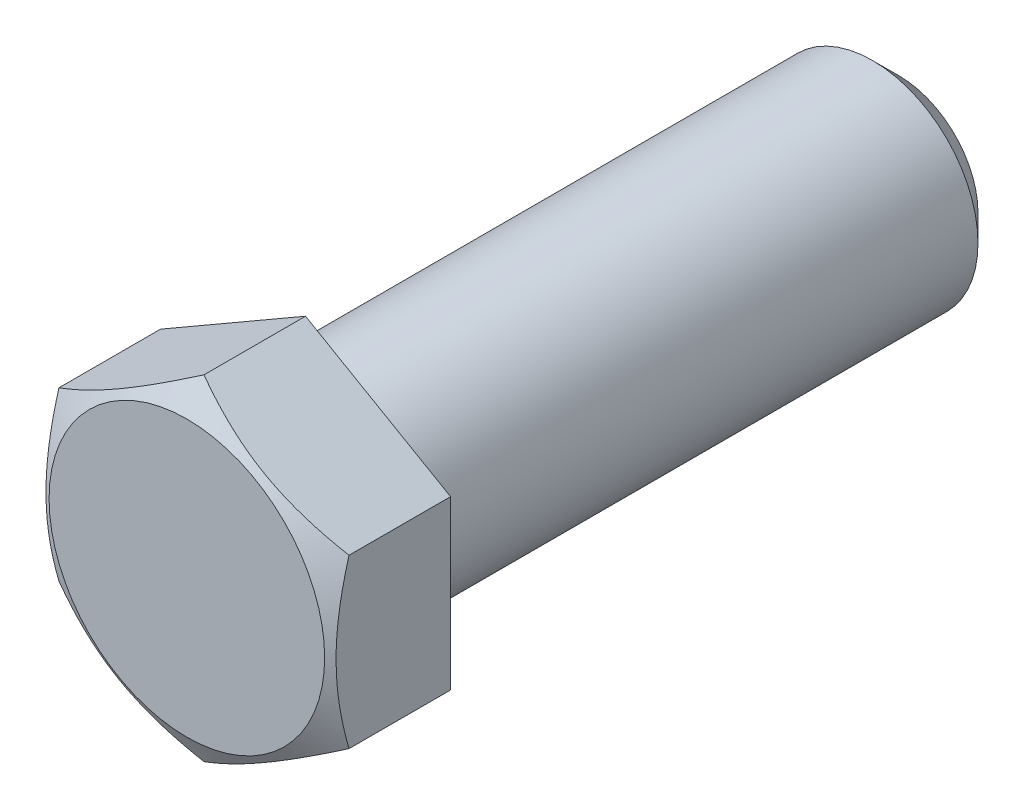
ISO-10303-21;
HEADER;
FILE_DESCRIPTION(('STEP AP214'),'2;1');
FILE_NAME('part.step','',(''),(''),'','','');
FILE_SCHEMA(('AUTOMOTIVE_DESIGN { 1 0 10303 214 1 1 1 1 }'));
ENDSEC;
DATA;
#1=APPLICATION_CONTEXT('core data for automotive mechanical design processes');
#2=APPLICATION_PROTOCOL_DEFINITION('international standard','automotive_design',2000,#1);
#3=PRODUCT_CONTEXT('',#1,'mechanical');
#4=PRODUCT('Part','Part','',(#3));
#5=PRODUCT_RELATED_PRODUCT_CATEGORY('part','',(#4));
#6=PRODUCT_DEFINITION_FORMATION('','',#4);
#7=PRODUCT_DEFINITION_CONTEXT('part definition',#1,'design');
#8=PRODUCT_DEFINITION('design','',#6,#7);
#9=PRODUCT_DEFINITION_SHAPE('','',#8);
#10=(LENGTH_UNIT() NAMED_UNIT(*) SI_UNIT(.MILLI.,.METRE.));
#11=(NAMED_UNIT(*) PLANE_ANGLE_UNIT() SI_UNIT($,.RADIAN.));
#12=(NAMED_UNIT(*) SI_UNIT($,.STERADIAN.) SOLID_ANGLE_UNIT());
#13=UNCERTAINTY_MEASURE_WITH_UNIT(LENGTH_MEASURE(1.E-05),#10,'distance_accuracy_value','');
#14=(GEOMETRIC_REPRESENTATION_CONTEXT(3) GLOBAL_UNCERTAINTY_ASSIGNED_CONTEXT((#13)) GLOBAL_UNIT_ASSIGNED_CONTEXT((#10,
#11,#12)) REPRESENTATION_CONTEXT('',''));
#15=CARTESIAN_POINT('',(0.,0.,0.));
#16=DIRECTION('',(0.,0.,1.));
#17=DIRECTION('',(1.,0.,0.));
#18=AXIS2_PLACEMENT_3D('',#15,#16,#17);
#19=CARTESIAN_POINT('',(-11.,-6.35085296108588,0.));
#20=DIRECTION('',(0.,0.,-1.));
#21=DIRECTION('',(-1.,0.,0.));
#22=AXIS2_PLACEMENT_3D('',#19,#20,#21);
#23=PLANE('',#22);
#24=DIRECTION('',(0.866025403784439,-0.5,0.));
#25=VECTOR('',#24,1.);
#26=CARTESIAN_POINT('',(-11.,-6.35085296108588,0.));
#27=LINE('',#26,#25);
#28=CARTESIAN_POINT('',(-11.,-6.35085296108588,0.));
#29=VERTEX_POINT('',#28);
#30=CARTESIAN_POINT('',(0.,-12.7017059221718,0.));
#31=VERTEX_POINT('',#30);
#32=EDGE_CURVE('E101',#29,#31,#27,.T.);
#33=ORIENTED_EDGE('',*,*,#32,.F.);
#34=DIRECTION('',(0.,-1.,0.));
#35=VECTOR('',#34,1.);
#36=CARTESIAN_POINT('',(-11.,6.35085296108588,0.));
#37=LINE('',#36,#35);
#38=CARTESIAN_POINT('',(-11.,6.35085296108588,0.));
#39=VERTEX_POINT('',#38);
#40=EDGE_CURVE('E106',#39,#29,#37,.T.);
#41=ORIENTED_EDGE('',*,*,#40,.F.);
#42=DIRECTION('',(-0.866025403784439,-0.5,0.));
#43=VECTOR('',#42,1.);
#44=CARTESIAN_POINT('',(0.,12.7017059221718,0.));
#45=LINE('',#44,#43);
#46=CARTESIAN_POINT('',(0.,12.7017059221718,0.));
#47=VERTEX_POINT('',#46);
#48=EDGE_CURVE('E112',#47,#39,#45,.T.);
#49=ORIENTED_EDGE('',*,*,#48,.F.);
#50=DIRECTION('',(-0.866025403784439,0.5,0.));
#51=VECTOR('',#50,1.);
#52=CARTESIAN_POINT('',(11.,6.35085296108588,0.));
#53=LINE('',#52,#51);
#54=CARTESIAN_POINT('',(11.,6.35085296108588,0.));
#55=VERTEX_POINT('',#54);
#56=EDGE_CURVE('E210',#55,#47,#53,.T.);
#57=ORIENTED_EDGE('',*,*,#56,.F.);
#58=DIRECTION('',(0.,1.,0.));
#59=VECTOR('',#58,1.);
#60=CARTESIAN_POINT('',(11.,-6.35085296108588,0.));
#61=LINE('',#60,#59);
#62=CARTESIAN_POINT('',(11.,-6.35085296108588,0.));
#63=VERTEX_POINT('',#62);
#64=EDGE_CURVE('E207',#63,#55,#61,.T.);
#65=ORIENTED_EDGE('',*,*,#64,.F.);
#66=DIRECTION('',(0.866025403784439,0.5,0.));
#67=VECTOR('',#66,1.);
#68=CARTESIAN_POINT('',(0.,-12.7017059221718,0.));
#69=LINE('',#68,#67);
#70=EDGE_CURVE('E204',#31,#63,#69,.T.);
#71=ORIENTED_EDGE('',*,*,#70,.F.);
#72=EDGE_LOOP('',(#33,#41,#49,#57,#65,#71));
#73=FACE_BOUND('',#72,.T.);
#74=CARTESIAN_POINT('',(0.,0.,0.));
#75=DIRECTION('',(0.,0.,-1.));
#76=DIRECTION('',(-1.,0.,0.));
#77=AXIS2_PLACEMENT_3D('',#74,#75,#76);
#78=CIRCLE('',#77,8.);
#79=CARTESIAN_POINT('',(8.,0.,0.));
#80=VERTEX_POINT('',#79);
#81=EDGE_CURVE('E264',#80,#80,#78,.T.);
#82=ORIENTED_EDGE('',*,*,#81,.F.);
#83=EDGE_LOOP('',(#82));
#84=FACE_BOUND('',#83,.T.);
#85=ADVANCED_FACE('F38',(#73,#84),#23,.T.);
#86=CARTESIAN_POINT('',(-11.,-6.35085296108588,9.));
#87=DIRECTION('',(0.5,0.866025403784439,0.));
#88=DIRECTION('',(-0.866025403784439,0.5,0.));
#89=AXIS2_PLACEMENT_3D('',#86,#87,#88);
#90=PLANE('',#89);
#91=CARTESIAN_POINT('',(-11.0002,-6.35073749103204,7.69991031212252));
#92=CARTESIAN_POINT('',(-10.7583962140202,-6.49034297195857,7.78049819661018));
#93=CARTESIAN_POINT('',(-10.515690859196,-6.63046897390006,7.85742843044833));
#94=CARTESIAN_POINT('',(-10.0283338351852,-6.91184468290416,8.00295870862612));
#95=CARTESIAN_POINT('',(-9.78368155388857,-7.05309474336861,8.07155601318414));
#96=CARTESIAN_POINT('',(-9.04578263598059,-7.47912088225752,8.26352099740352));
#97=CARTESIAN_POINT('',(-8.54962304616235,-7.7655787550001,8.37270963004095));
#98=CARTESIAN_POINT('',(-7.8071429686662,-8.19424982761043,8.50074323475039));
#99=CARTESIAN_POINT('',(-7.56304065829185,-8.33518236221487,8.53721514750099));
#100=CARTESIAN_POINT('',(-7.07370581962323,-8.61769996304406,8.59837604550269));
#101=CARTESIAN_POINT('',(-6.82847326966691,-8.7592850417754,8.62306480396288));
#102=CARTESIAN_POINT('',(-6.33759931419012,-9.0426912521081,8.66002700427186));
#103=CARTESIAN_POINT('',(-6.09195874362649,-9.18451190164691,8.67231519963538));
#104=CARTESIAN_POINT('',(-5.60044998596644,-9.46828461519099,8.68421442495612));
#105=CARTESIAN_POINT('',(-5.35458180613744,-9.61023667500043,8.68382584660124));
#106=CARTESIAN_POINT('',(-4.89492981445333,-9.8756168761328,8.6712561825714));
#107=CARTESIAN_POINT('',(-4.68111322379347,-9.99906394230748,8.66060831994059));
#108=CARTESIAN_POINT('',(-4.25397181732484,-10.2456741483142,8.62992572415361));
#109=CARTESIAN_POINT('',(-4.0406470373753,-10.3688372674429,8.60989032700365));
#110=CARTESIAN_POINT('',(-3.61460518506879,-10.6148126455581,8.56078196624697));
#111=CARTESIAN_POINT('',(-3.40188876164769,-10.7376245298813,8.53170153793867));
#112=CARTESIAN_POINT('',(-2.97745318356422,-10.9826725251414,8.46501335258341));
#113=CARTESIAN_POINT('',(-2.76573409768588,-11.1049085963659,8.42740501592751));
#114=CARTESIAN_POINT('',(-2.12304886825006,-11.4759630865848,8.30083743560115));
#115=CARTESIAN_POINT('',(-1.69394387154657,-11.7237069719422,8.19925789346635));
#116=CARTESIAN_POINT('',(-0.842132493034874,-12.2155005006247,7.96871365228279));
#117=CARTESIAN_POINT('',(-0.419415204513995,-12.4595564409434,7.83980310013818));
#118=CARTESIAN_POINT('',(0.000200000000004617,-12.7018213922256,7.69991031212252));
#119=B_SPLINE_CURVE_WITH_KNOTS('',3,(#91,#92,#93,#94,#95,#96,#97,#98,#99,#100,#101,#102,#103,
#104,#105,#106,#107,#108,#109,#110,#111,#112,#113,#114,#115,#116,#117,#118),.UNSPECIFIED.,.F.,
.F.,(4,2,2,2,2,2,2,2,2,2,2,2,2,4),(0.,0.871755124656707,1.74379610209014,3.49159027742165,
4.34403665487446,5.19649943874035,6.04794680882169,6.89936787084372,7.64056020263244,
8.38180496793424,9.1236630996721,9.86557166775902,11.3820155381851,12.8954827156567),.UNSPECIFIED.);
#120=CARTESIAN_POINT('',(-11.,-6.35085296108588,7.69997697969827));
#121=VERTEX_POINT('',#120);
#122=CARTESIAN_POINT('',(0.,-12.7017059221718,7.69997697969827));
#123=VERTEX_POINT('',#122);
#124=EDGE_CURVE('E93',#121,#123,#119,.T.);
#125=ORIENTED_EDGE('',*,*,#124,.F.);
#126=DIRECTION('',(0.,0.,-1.));
#127=VECTOR('',#126,1.);
#128=CARTESIAN_POINT('',(-11.,-6.35085296108588,9.));
#129=LINE('',#128,#127);
#130=EDGE_CURVE('E62',#121,#29,#129,.T.);
#131=ORIENTED_EDGE('',*,*,#130,.T.);
#132=ORIENTED_EDGE('',*,*,#32,.T.);
#133=DIRECTION('',(0.,0.,-1.));
#134=VECTOR('',#133,1.);
#135=CARTESIAN_POINT('',(0.,-12.7017059221718,9.));
#136=LINE('',#135,#134);
#137=EDGE_CURVE('E100',#123,#31,#136,.T.);
#138=ORIENTED_EDGE('',*,*,#137,.F.);
#139=EDGE_LOOP('',(#125,#131,#132,#138));
#140=FACE_BOUND('',#139,.T.);
#141=ADVANCED_FACE('F40',(#140),#90,.F.);
#142=CARTESIAN_POINT('',(0.,-12.7017059221718,9.));
#143=DIRECTION('',(-0.5,0.866025403784439,0.));
#144=DIRECTION('',(-0.866025403784439,-0.5,0.));
#145=AXIS2_PLACEMENT_3D('',#142,#143,#144);
#146=PLANE('',#145);
#147=CARTESIAN_POINT('',(-0.000199999999998275,-12.7018213922256,7.69991031212252));
#148=CARTESIAN_POINT('',(0.24160378597983,-12.5622159112991,7.78049819661019));
#149=CARTESIAN_POINT('',(0.484309140803985,-12.4220899093576,7.85742843044834));
#150=CARTESIAN_POINT('',(0.971666164814807,-12.1407142003535,8.00295870862612));
#151=CARTESIAN_POINT('',(1.21631844611142,-11.999464139889,8.07155601318414));
#152=CARTESIAN_POINT('',(1.9542173640194,-11.5734380010001,8.26352099740352));
#153=CARTESIAN_POINT('',(2.45037695383764,-11.2869801282575,8.37270963004095));
#154=CARTESIAN_POINT('',(3.19285703133379,-10.8583090556472,8.50074323475039));
#155=CARTESIAN_POINT('',(3.43695934170814,-10.7173765210428,8.53721514750099));
#156=CARTESIAN_POINT('',(3.92629418037676,-10.4348589202136,8.59837604550269));
#157=CARTESIAN_POINT('',(4.17152673033308,-10.2932738414822,8.62306480396288));
#158=CARTESIAN_POINT('',(4.66240068580987,-10.0098676311495,8.66002700427186));
#159=CARTESIAN_POINT('',(4.9080412563735,-9.86804698161072,8.67231519963538));
#160=CARTESIAN_POINT('',(5.39955001403355,-9.58427426806664,8.68421442495612));
#161=CARTESIAN_POINT('',(5.64541819386255,-9.4423222082572,8.68382584660124));
#162=CARTESIAN_POINT('',(6.10507018554666,-9.17694200712483,8.6712561825714));
#163=CARTESIAN_POINT('',(6.31888677620652,-9.05349494095015,8.66060831994059));
#164=CARTESIAN_POINT('',(6.74602818267515,-8.80688473494346,8.62992572415361));
#165=CARTESIAN_POINT('',(6.95935296262468,-8.68372161581477,8.60989032700365));
#166=CARTESIAN_POINT('',(7.38539481493119,-8.43774623769956,8.56078196624697));
#167=CARTESIAN_POINT('',(7.59811123835229,-8.31493435337634,8.53170153793867));
#168=CARTESIAN_POINT('',(8.02254681643577,-8.06988635811619,8.46501335258341));
#169=CARTESIAN_POINT('',(8.2342659023141,-7.94765028689175,8.42740501592751));
#170=CARTESIAN_POINT('',(8.87695113174992,-7.57659579667278,8.30083743560115));
#171=CARTESIAN_POINT('',(9.30605612845342,-7.32885191131541,8.19925789346635));
#172=CARTESIAN_POINT('',(10.1578675069651,-6.83705838263289,7.96871365228279));
#173=CARTESIAN_POINT('',(10.580584795486,-6.59300244231426,7.83980310013818));
#174=CARTESIAN_POINT('',(11.0002,-6.35073749103204,7.69991031212252));
#175=B_SPLINE_CURVE_WITH_KNOTS('',3,(#147,#148,#149,#150,#151,#152,#153,#154,#155,#156,#157,
#158,#159,#160,#161,#162,#163,#164,#165,#166,#167,#168,#169,#170,#171,#172,#173,#174),
.UNSPECIFIED.,.F.,.F.,(4,2,2,2,2,2,2,2,2,2,2,2,2,4),(0.,0.871755124656706,1.74379610209014,
3.49159027742165,4.34403665487447,5.19649943874035,6.04794680882169,6.89936787084372,
7.64056020263244,8.38180496793424,9.12366309967209,9.86557166775901,11.3820155381851,
12.8954827156567),.UNSPECIFIED.);
#176=CARTESIAN_POINT('',(11.,-6.35085296108588,7.69997697969827));
#177=VERTEX_POINT('',#176);
#178=EDGE_CURVE('E102',#123,#177,#175,.T.);
#179=ORIENTED_EDGE('',*,*,#178,.F.);
#180=ORIENTED_EDGE('',*,*,#137,.T.);
#181=ORIENTED_EDGE('',*,*,#70,.T.);
#182=DIRECTION('',(0.,0.,-1.));
#183=VECTOR('',#182,1.);
#184=CARTESIAN_POINT('',(11.,-6.35085296108588,9.));
#185=LINE('',#184,#183);
#186=EDGE_CURVE('E119',#177,#63,#185,.T.);
#187=ORIENTED_EDGE('',*,*,#186,.F.);
#188=EDGE_LOOP('',(#179,#180,#181,#187));
#189=FACE_BOUND('',#188,.T.);
#190=ADVANCED_FACE('F142',(#189),#146,.F.);
#191=CARTESIAN_POINT('',(11.,-6.35085296108588,9.));
#192=DIRECTION('',(-1.,0.,0.));
#193=DIRECTION('',(0.,-1.,0.));
#194=AXIS2_PLACEMENT_3D('',#191,#192,#193);
#195=PLANE('',#194);
#196=CARTESIAN_POINT('',(11.,-17.2464911296092,3.22312464861902));
#197=CARTESIAN_POINT('',(11.,-17.0054367646226,3.34046013262627));
#198=CARTESIAN_POINT('',(11.,-16.764104501324,3.45722443493462));
#199=CARTESIAN_POINT('',(11.,-16.2808262398906,3.68948165019535));
#200=CARTESIAN_POINT('',(11.,-16.0388802358782,3.80497455091487));
#201=CARTESIAN_POINT('',(11.,-15.3119727553016,4.1493818870059));
#202=CARTESIAN_POINT('',(11.,-14.8260103383745,4.37619151007057));
#203=CARTESIAN_POINT('',(11.,-13.8483396083415,4.82404193374142));
#204=CARTESIAN_POINT('',(11.,-13.356614524598,5.04504620896831));
#205=CARTESIAN_POINT('',(11.,-12.3693179467524,5.4782584112522));
#206=CARTESIAN_POINT('',(11.,-11.8737466304613,5.69046674210292));
#207=CARTESIAN_POINT('',(11.,-10.8614360638773,6.11062721579748));
#208=CARTESIAN_POINT('',(11.,-10.3445402828292,6.31820413911403));
#209=CARTESIAN_POINT('',(11.,-9.30476788803953,6.71809733180032));
#210=CARTESIAN_POINT('',(11.,-8.78189062103283,6.91041191573921));
#211=CARTESIAN_POINT('',(11.,-7.73025868073694,7.27486668005401));
#212=CARTESIAN_POINT('',(11.,-7.20151770966068,7.44704608857844));
#213=CARTESIAN_POINT('',(11.,-6.13640501022997,7.76584119822092));
#214=CARTESIAN_POINT('',(11.,-5.60003568079028,7.91246475177339));
#215=CARTESIAN_POINT('',(11.,-4.79110163376215,8.10762971103769));
#216=CARTESIAN_POINT('',(11.,-4.52147603063684,8.16842251436701));
#217=CARTESIAN_POINT('',(11.,-3.98034858421758,8.28103955124122));
#218=CARTESIAN_POINT('',(11.,-3.70884677762707,8.33286395971781));
#219=CARTESIAN_POINT('',(11.,-3.16414179875767,8.42664112797942));
#220=CARTESIAN_POINT('',(11.,-2.89093866792592,8.46859412729055));
#221=CARTESIAN_POINT('',(11.,-2.34310365500423,8.54179938886165));
#222=CARTESIAN_POINT('',(11.,-2.0684718308279,8.57305208149119));
#223=CARTESIAN_POINT('',(11.,-1.52183214965425,8.62383312753415));
#224=CARTESIAN_POINT('',(11.,-1.24983845583164,8.64351300166273));
#225=CARTESIAN_POINT('',(11.,-0.705262476683622,8.67134409072828));
#226=CARTESIAN_POINT('',(11.,-0.432680201493873,8.67949550263005));
#227=CARTESIAN_POINT('',(11.,0.112587835891126,8.68407484508647));
#228=CARTESIAN_POINT('',(11.,0.38527359904707,8.68050266400868));
#229=CARTESIAN_POINT('',(11.,0.930247121447649,8.66172413546883));
#230=CARTESIAN_POINT('',(11.,1.20253486182486,8.64651725333113));
#231=CARTESIAN_POINT('',(11.,1.85118525736049,8.59675909224682));
#232=CARTESIAN_POINT('',(11.,2.22715790324858,8.55700713227324));
#233=CARTESIAN_POINT('',(11.,2.97641800324754,8.45744634081668));
#234=CARTESIAN_POINT('',(11.,3.34970510825656,8.39763494820226));
#235=CARTESIAN_POINT('',(11.,4.46503871970584,8.19127478751773));
#236=CARTESIAN_POINT('',(11.,5.20218115080469,8.01783282347045));
#237=CARTESIAN_POINT('',(11.,6.30495529893798,7.71565314333932));
#238=CARTESIAN_POINT('',(11.,6.67626405214154,7.60643045986558));
#239=CARTESIAN_POINT('',(11.,7.41527726359713,7.376296585609));
#240=CARTESIAN_POINT('',(11.,7.78298169423548,7.25538530535365));
#241=CARTESIAN_POINT('',(11.,8.51490030986666,7.00384298001303));
#242=CARTESIAN_POINT('',(11.,8.8791154776092,6.87321476831688));
#243=CARTESIAN_POINT('',(11.,9.60450041068216,6.60381015953933));
#244=CARTESIAN_POINT('',(11.,9.96567024502994,6.4650339476893));
#245=CARTESIAN_POINT('',(11.,10.9384447785836,6.08067062571096));
#246=CARTESIAN_POINT('',(11.,11.5474933996492,5.82862053725673));
#247=CARTESIAN_POINT('',(11.,12.7593425198257,5.3098704711097));
#248=CARTESIAN_POINT('',(11.,13.3621423249851,5.04316888660566));
#249=CARTESIAN_POINT('',(11.,14.5629320427798,4.49859056671787));
#250=CARTESIAN_POINT('',(11.,15.1609200412522,4.22070962462236));
#251=CARTESIAN_POINT('',(11.,16.3528304264568,3.65645052632228));
#252=CARTESIAN_POINT('',(11.,16.9467529760523,3.37007271298597));
#253=CARTESIAN_POINT('',(11.,18.132282559283,2.79021169539684));
#254=CARTESIAN_POINT('',(11.,18.7238844120932,2.49671792101384));
#255=CARTESIAN_POINT('',(11.,19.9044377557376,1.90444424754037));
#256=CARTESIAN_POINT('',(11.,20.4933892246422,1.60566430481207));
#257=CARTESIAN_POINT('',(11.,21.6689891184118,1.00392232560173));
#258=CARTESIAN_POINT('',(11.,22.2556380120896,0.700961203937494));
#259=CARTESIAN_POINT('',(11.,23.4271314779866,0.0915785752830149));
#260=CARTESIAN_POINT('',(11.,24.0119760559775,-0.214842920623581));
#261=CARTESIAN_POINT('',(11.,25.640676722209,-1.07322739161237));
#262=CARTESIAN_POINT('',(11.,26.6828887020545,-1.62830927077114));
#263=CARTESIAN_POINT('',(11.,28.7638469417126,-2.74506862041726));
#264=CARTESIAN_POINT('',(11.,29.8025929856492,-3.30674649224022));
#265=CARTESIAN_POINT('',(11.,31.8739721460183,-4.43315209410968));
#266=CARTESIAN_POINT('',(11.,32.9066141136532,-4.99786355781515));
#267=CARTESIAN_POINT('',(11.,34.4539909478882,-5.84772063596346));
#268=CARTESIAN_POINT('',(11.,34.9694990124791,-6.13146030701517));
#269=CARTESIAN_POINT('',(11.,36.0000548736311,-6.69977285470187));
#270=CARTESIAN_POINT('',(11.,36.5151026707549,-6.98434573031611));
#271=CARTESIAN_POINT('',(11.,37.0299485109439,-7.26928360728143));
#272=B_SPLINE_CURVE_WITH_KNOTS('',3,(#196,#197,#198,#199,#200,#201,#202,#203,#204,#205,#206,
#207,#208,#209,#210,#211,#212,#213,#214,#215,#216,#217,#218,#219,#220,#221,#222,#223,#224,#225,
#226,#227,#228,#229,#230,#231,#232,#233,#234,#235,#236,#237,#238,#239,#240,#241,#242,#243,#244,
#245,#246,#247,#248,#249,#250,#251,#252,#253,#254,#255,#256,#257,#258,#259,#260,#261,#262,#263,
#264,#265,#266,#267,#268,#269,#270,#271),.UNSPECIFIED.,.F.,.F.,(4,2,2,2,2,2,2,2,2,2,2,2,2,2,2,2,
2,2,2,2,2,2,2,2,2,2,2,2,2,2,2,2,2,2,2,2,2,4),(0.,0.804283006661877,1.60857374501796,
3.21738397309541,4.8346380112781,6.45181772407605,8.12268864731055,9.79374382998415,
11.4614871573563,13.12871713776,13.9577746058793,14.7868159011177,15.6158370779001,
16.4448249072816,17.2627022968465,18.0805657127349,18.8984369163693,19.7163457077406,
20.8499144337113,21.9836279456538,24.2521832434838,25.413200350726,26.5742263458914,
27.7349151111904,28.895577500351,30.8727191785331,32.8500781219175,34.8281882213261,
36.8062186077254,38.7873929609712,40.7685836766337,42.7493475830248,44.7301051467904,
48.2725102421986,51.8151320049621,55.3460185257757,57.111325560399,58.8766304332636),.UNSPECIFIED.);
#273=CARTESIAN_POINT('',(11.,6.35085296108588,7.69997697969827));
#274=VERTEX_POINT('',#273);
#275=EDGE_CURVE('E176',#177,#274,#272,.T.);
#276=ORIENTED_EDGE('',*,*,#275,.F.);
#277=ORIENTED_EDGE('',*,*,#186,.T.);
#278=ORIENTED_EDGE('',*,*,#64,.T.);
#279=DIRECTION('',(0.,0.,-1.));
#280=VECTOR('',#279,1.);
#281=CARTESIAN_POINT('',(11.,6.35085296108588,9.));
#282=LINE('',#281,#280);
#283=EDGE_CURVE('E117',#274,#55,#282,.T.);
#284=ORIENTED_EDGE('',*,*,#283,.F.);
#285=EDGE_LOOP('',(#276,#277,#278,#284));
#286=FACE_BOUND('',#285,.T.);
#287=ADVANCED_FACE('F186',(#286),#195,.F.);
#288=CARTESIAN_POINT('',(11.,6.35085296108588,9.));
#289=DIRECTION('',(-0.5,-0.866025403784439,0.));
#290=DIRECTION('',(0.866025403784439,-0.5,0.));
#291=AXIS2_PLACEMENT_3D('',#288,#289,#290);
#292=PLANE('',#291);
#293=CARTESIAN_POINT('',(11.0002,6.35073749103204,7.69991031212252));
#294=CARTESIAN_POINT('',(10.7583962140202,6.49034297195857,7.78049819661019));
#295=CARTESIAN_POINT('',(10.515690859196,6.63046897390006,7.85742843044834));
#296=CARTESIAN_POINT('',(10.0283338351852,6.91184468290416,8.00295870862612));
#297=CARTESIAN_POINT('',(9.78368155388857,7.05309474336861,8.07155601318414));
#298=CARTESIAN_POINT('',(9.04578263598059,7.47912088225752,8.26352099740352));
#299=CARTESIAN_POINT('',(8.54962304616235,7.76557875500009,8.37270963004095));
#300=CARTESIAN_POINT('',(7.8071429686662,8.19424982761043,8.50074323475039));
#301=CARTESIAN_POINT('',(7.56304065829185,8.33518236221487,8.53721514750099));
#302=CARTESIAN_POINT('',(7.07370581962323,8.61769996304406,8.59837604550269));
#303=CARTESIAN_POINT('',(6.8284732696669,8.7592850417754,8.62306480396288));
#304=CARTESIAN_POINT('',(6.33759931419012,9.0426912521081,8.66002700427186));
#305=CARTESIAN_POINT('',(6.09195874362649,9.18451190164691,8.67231519963538));
#306=CARTESIAN_POINT('',(5.60044998596644,9.46828461519099,8.68421442495612));
#307=CARTESIAN_POINT('',(5.35458180613744,9.61023667500043,8.68382584660124));
#308=CARTESIAN_POINT('',(4.89492981445333,9.8756168761328,8.6712561825714));
#309=CARTESIAN_POINT('',(4.68111322379347,9.99906394230748,8.66060831994059));
#310=CARTESIAN_POINT('',(4.25397181732484,10.2456741483142,8.62992572415361));
#311=CARTESIAN_POINT('',(4.0406470373753,10.3688372674429,8.60989032700365));
#312=CARTESIAN_POINT('',(3.61460518506879,10.6148126455581,8.56078196624697));
#313=CARTESIAN_POINT('',(3.40188876164769,10.7376245298813,8.53170153793867));
#314=CARTESIAN_POINT('',(2.97745318356422,10.9826725251414,8.46501335258341));
#315=CARTESIAN_POINT('',(2.76573409768588,11.1049085963659,8.42740501592751));
#316=CARTESIAN_POINT('',(2.12304886825006,11.4759630865848,8.30083743560115));
#317=CARTESIAN_POINT('',(1.69394387154657,11.7237069719422,8.19925789346635));
#318=CARTESIAN_POINT('',(0.842132493034875,12.2155005006247,7.96871365228279));
#319=CARTESIAN_POINT('',(0.419415204513996,12.4595564409434,7.83980310013818));
#320=CARTESIAN_POINT('',(-0.000200000000003672,12.7018213922256,7.69991031212252));
#321=B_SPLINE_CURVE_WITH_KNOTS('',3,(#293,#294,#295,#296,#297,#298,#299,#300,#301,#302,#303,
#304,#305,#306,#307,#308,#309,#310,#311,#312,#313,#314,#315,#316,#317,#318,#319,#320),
.UNSPECIFIED.,.F.,.F.,(4,2,2,2,2,2,2,2,2,2,2,2,2,4),(0.,0.871755124656707,1.74379610209014,
3.49159027742165,4.34403665487447,5.19649943874035,6.04794680882169,6.89936787084372,
7.64056020263244,8.38180496793424,9.1236630996721,9.86557166775902,11.3820155381851,
12.8954827156567),.UNSPECIFIED.);
#322=CARTESIAN_POINT('',(0.,12.7017059221718,7.69997697969827));
#323=VERTEX_POINT('',#322);
#324=EDGE_CURVE('E170',#274,#323,#321,.T.);
#325=ORIENTED_EDGE('',*,*,#324,.F.);
#326=ORIENTED_EDGE('',*,*,#283,.T.);
#327=ORIENTED_EDGE('',*,*,#56,.T.);
#328=DIRECTION('',(0.,0.,-1.));
#329=VECTOR('',#328,1.);
#330=CARTESIAN_POINT('',(0.,12.7017059221718,9.));
#331=LINE('',#330,#329);
#332=EDGE_CURVE('E110',#323,#47,#331,.T.);
#333=ORIENTED_EDGE('',*,*,#332,.F.);
#334=EDGE_LOOP('',(#325,#326,#327,#333));
#335=FACE_BOUND('',#334,.T.);
#336=ADVANCED_FACE('F183',(#335),#292,.F.);
#337=CARTESIAN_POINT('',(0.,12.7017059221718,9.));
#338=DIRECTION('',(0.5,-0.866025403784439,0.));
#339=DIRECTION('',(0.866025403784439,0.5,0.));
#340=AXIS2_PLACEMENT_3D('',#337,#338,#339);
#341=PLANE('',#340);
#342=CARTESIAN_POINT('',(0.000199999999998542,12.7018213922256,7.69991031212252));
#343=CARTESIAN_POINT('',(-0.24160378597983,12.5622159112991,7.78049819661018));
#344=CARTESIAN_POINT('',(-0.484309140803985,12.4220899093576,7.85742843044833));
#345=CARTESIAN_POINT('',(-0.971666164814808,12.1407142003535,8.00295870862612));
#346=CARTESIAN_POINT('',(-1.21631844611142,11.999464139889,8.07155601318414));
#347=CARTESIAN_POINT('',(-1.9542173640194,11.5734380010001,8.26352099740352));
#348=CARTESIAN_POINT('',(-2.45037695383764,11.2869801282575,8.37270963004095));
#349=CARTESIAN_POINT('',(-3.19285703133379,10.8583090556472,8.50074323475039));
#350=CARTESIAN_POINT('',(-3.43695934170814,10.7173765210428,8.53721514750099));
#351=CARTESIAN_POINT('',(-3.92629418037676,10.4348589202136,8.59837604550269));
#352=CARTESIAN_POINT('',(-4.17152673033308,10.2932738414822,8.62306480396288));
#353=CARTESIAN_POINT('',(-4.66240068580987,10.0098676311495,8.66002700427186));
#354=CARTESIAN_POINT('',(-4.9080412563735,9.86804698161073,8.67231519963538));
#355=CARTESIAN_POINT('',(-5.39955001403355,9.58427426806664,8.68421442495612));
#356=CARTESIAN_POINT('',(-5.64541819386255,9.4423222082572,8.68382584660124));
#357=CARTESIAN_POINT('',(-6.10507018554666,9.17694200712483,8.6712561825714));
#358=CARTESIAN_POINT('',(-6.31888677620652,9.05349494095016,8.66060831994059));
#359=CARTESIAN_POINT('',(-6.74602818267515,8.80688473494346,8.62992572415361));
#360=CARTESIAN_POINT('',(-6.95935296262469,8.68372161581477,8.60989032700365));
#361=CARTESIAN_POINT('',(-7.3853948149312,8.43774623769956,8.56078196624697));
#362=CARTESIAN_POINT('',(-7.5981112383523,8.31493435337634,8.53170153793867));
#363=CARTESIAN_POINT('',(-8.02254681643577,8.06988635811619,8.46501335258341));
#364=CARTESIAN_POINT('',(-8.2342659023141,7.94765028689175,8.42740501592751));
#365=CARTESIAN_POINT('',(-8.87695113174992,7.57659579667278,8.30083743560114));
#366=CARTESIAN_POINT('',(-9.30605612845342,7.32885191131541,8.19925789346635));
#367=CARTESIAN_POINT('',(-10.1578675069651,6.8370583826329,7.96871365228279));
#368=CARTESIAN_POINT('',(-10.580584795486,6.59300244231426,7.83980310013818));
#369=CARTESIAN_POINT('',(-11.0002,6.35073749103204,7.69991031212252));
#370=B_SPLINE_CURVE_WITH_KNOTS('',3,(#342,#343,#344,#345,#346,#347,#348,#349,#350,#351,#352,
#353,#354,#355,#356,#357,#358,#359,#360,#361,#362,#363,#364,#365,#366,#367,#368,#369),
.UNSPECIFIED.,.F.,.F.,(4,2,2,2,2,2,2,2,2,2,2,2,2,4),(0.,0.871755124656706,1.74379610209014,
3.49159027742165,4.34403665487446,5.19649943874035,6.04794680882169,6.89936787084372,
7.64056020263244,8.38180496793424,9.12366309967209,9.86557166775901,11.3820155381851,
12.8954827156567),.UNSPECIFIED.);
#371=CARTESIAN_POINT('',(-11.,6.35085296108588,7.69997697969827));
#372=VERTEX_POINT('',#371);
#373=EDGE_CURVE('E54',#323,#372,#370,.T.);
#374=ORIENTED_EDGE('',*,*,#373,.F.);
#375=ORIENTED_EDGE('',*,*,#332,.T.);
#376=ORIENTED_EDGE('',*,*,#48,.T.);
#377=DIRECTION('',(0.,0.,-1.));
#378=VECTOR('',#377,1.);
#379=CARTESIAN_POINT('',(-11.,6.35085296108588,9.));
#380=LINE('',#379,#378);
#381=EDGE_CURVE('E108',#372,#39,#380,.T.);
#382=ORIENTED_EDGE('',*,*,#381,.F.);
#383=EDGE_LOOP('',(#374,#375,#376,#382));
#384=FACE_BOUND('',#383,.T.);
#385=ADVANCED_FACE('F155',(#384),#341,.F.);
#386=CARTESIAN_POINT('',(-11.,6.35085296108588,9.));
#387=DIRECTION('',(1.,0.,0.));
#388=DIRECTION('',(0.,1.,0.));
#389=AXIS2_PLACEMENT_3D('',#386,#387,#388);
#390=PLANE('',#389);
#391=CARTESIAN_POINT('',(-11.,-17.2464911296092,3.22312464861902));
#392=CARTESIAN_POINT('',(-11.,-17.0054367646226,3.34046013262627));
#393=CARTESIAN_POINT('',(-11.,-16.764104501324,3.45722443493462));
#394=CARTESIAN_POINT('',(-11.,-16.2808262398906,3.68948165019535));
#395=CARTESIAN_POINT('',(-11.,-16.0388802358781,3.80497455091487));
#396=CARTESIAN_POINT('',(-11.,-15.3119727553016,4.14938188700591));
#397=CARTESIAN_POINT('',(-11.,-14.8260103383745,4.37619151007057));
#398=CARTESIAN_POINT('',(-11.,-13.8483396083415,4.82404193374142));
#399=CARTESIAN_POINT('',(-11.,-13.356614524598,5.04504620896831));
#400=CARTESIAN_POINT('',(-11.,-12.3693179467524,5.4782584112522));
#401=CARTESIAN_POINT('',(-11.,-11.8737466304613,5.69046674210292));
#402=CARTESIAN_POINT('',(-11.,-10.8614360638773,6.11062721579748));
#403=CARTESIAN_POINT('',(-11.,-10.3445402828292,6.31820413911403));
#404=CARTESIAN_POINT('',(-11.,-9.30476788803954,6.71809733180032));
#405=CARTESIAN_POINT('',(-11.,-8.78189062103283,6.9104119157392));
#406=CARTESIAN_POINT('',(-11.,-7.73025868073695,7.274866680054));
#407=CARTESIAN_POINT('',(-11.,-7.20151770966068,7.44704608857844));
#408=CARTESIAN_POINT('',(-11.,-6.13640501022997,7.76584119822092));
#409=CARTESIAN_POINT('',(-11.,-5.60003568079028,7.91246475177339));
#410=CARTESIAN_POINT('',(-11.,-4.79110163376216,8.10762971103768));
#411=CARTESIAN_POINT('',(-11.,-4.52147603063685,8.16842251436701));
#412=CARTESIAN_POINT('',(-11.,-3.98034858421758,8.28103955124122));
#413=CARTESIAN_POINT('',(-11.,-3.70884677762708,8.33286395971781));
#414=CARTESIAN_POINT('',(-11.,-3.16414179875767,8.42664112797942));
#415=CARTESIAN_POINT('',(-11.,-2.89093866792593,8.46859412729055));
#416=CARTESIAN_POINT('',(-11.,-2.34310365500424,8.54179938886165));
#417=CARTESIAN_POINT('',(-11.,-2.06847183082791,8.57305208149118));
#418=CARTESIAN_POINT('',(-11.,-1.52183214965425,8.62383312753415));
#419=CARTESIAN_POINT('',(-11.,-1.24983845583164,8.64351300166273));
#420=CARTESIAN_POINT('',(-11.,-0.705262476683627,8.67134409072828));
#421=CARTESIAN_POINT('',(-11.,-0.432680201493879,8.67949550263005));
#422=CARTESIAN_POINT('',(-11.,0.112587835891118,8.68407484508647));
#423=CARTESIAN_POINT('',(-11.,0.385273599047062,8.68050266400868));
#424=CARTESIAN_POINT('',(-11.,0.930247121447642,8.66172413546883));
#425=CARTESIAN_POINT('',(-11.,1.20253486182486,8.64651725333113));
#426=CARTESIAN_POINT('',(-11.,1.85118525736049,8.59675909224682));
#427=CARTESIAN_POINT('',(-11.,2.22715790324858,8.55700713227324));
#428=CARTESIAN_POINT('',(-11.,2.97641800324753,8.45744634081668));
#429=CARTESIAN_POINT('',(-11.,3.34970510825656,8.39763494820226));
#430=CARTESIAN_POINT('',(-11.,4.46503871970583,8.19127478751773));
#431=CARTESIAN_POINT('',(-11.,5.20218115080468,8.01783282347045));
#432=CARTESIAN_POINT('',(-11.,6.30495529893797,7.71565314333932));
#433=CARTESIAN_POINT('',(-11.,6.67626405214153,7.60643045986558));
#434=CARTESIAN_POINT('',(-11.,7.41527726359713,7.37629658560901));
#435=CARTESIAN_POINT('',(-11.,7.78298169423547,7.25538530535365));
#436=CARTESIAN_POINT('',(-11.,8.51490030986666,7.00384298001303));
#437=CARTESIAN_POINT('',(-11.,8.87911547760919,6.87321476831688));
#438=CARTESIAN_POINT('',(-11.,9.60450041068215,6.60381015953934));
#439=CARTESIAN_POINT('',(-11.,9.96567024502992,6.46503394768931));
#440=CARTESIAN_POINT('',(-11.,10.9384447785836,6.08067062571096));
#441=CARTESIAN_POINT('',(-11.,11.5474933996492,5.82862053725673));
#442=CARTESIAN_POINT('',(-11.,12.7593425198257,5.3098704711097));
#443=CARTESIAN_POINT('',(-11.,13.362142324985,5.04316888660566));
#444=CARTESIAN_POINT('',(-11.,14.5629320427798,4.49859056671788));
#445=CARTESIAN_POINT('',(-11.,15.1609200412522,4.22070962462236));
#446=CARTESIAN_POINT('',(-11.,16.3528304264568,3.65645052632229));
#447=CARTESIAN_POINT('',(-11.,16.9467529760523,3.37007271298597));
#448=CARTESIAN_POINT('',(-11.,18.132282559283,2.79021169539685));
#449=CARTESIAN_POINT('',(-11.,18.7238844120932,2.49671792101385));
#450=CARTESIAN_POINT('',(-11.,19.9044377557376,1.90444424754037));
#451=CARTESIAN_POINT('',(-11.,20.4933892246422,1.60566430481208));
#452=CARTESIAN_POINT('',(-11.,21.6689891184118,1.00392232560174));
#453=CARTESIAN_POINT('',(-11.,22.2556380120896,0.700961203937497));
#454=CARTESIAN_POINT('',(-11.,23.4271314779866,0.0915785752830174));
#455=CARTESIAN_POINT('',(-11.,24.0119760559775,-0.214842920623578));
#456=CARTESIAN_POINT('',(-11.,25.640676722209,-1.07322739161237));
#457=CARTESIAN_POINT('',(-11.,26.6828887020545,-1.62830927077114));
#458=CARTESIAN_POINT('',(-11.,28.7638469417126,-2.74506862041726));
#459=CARTESIAN_POINT('',(-11.,29.8025929856492,-3.30674649224021));
#460=CARTESIAN_POINT('',(-11.,31.8739721460183,-4.43315209410967));
#461=CARTESIAN_POINT('',(-11.,32.9066141136531,-4.99786355781515));
#462=CARTESIAN_POINT('',(-11.,34.4539909478882,-5.84772063596346));
#463=CARTESIAN_POINT('',(-11.,34.9694990124791,-6.13146030701516));
#464=CARTESIAN_POINT('',(-11.,36.0000548736311,-6.69977285470186));
#465=CARTESIAN_POINT('',(-11.,36.5151026707549,-6.98434573031611));
#466=CARTESIAN_POINT('',(-11.,37.0299485109439,-7.26928360728143));
#467=B_SPLINE_CURVE_WITH_KNOTS('',3,(#391,#392,#393,#394,#395,#396,#397,#398,#399,#400,#401,
#402,#403,#404,#405,#406,#407,#408,#409,#410,#411,#412,#413,#414,#415,#416,#417,#418,#419,#420,
#421,#422,#423,#424,#425,#426,#427,#428,#429,#430,#431,#432,#433,#434,#435,#436,#437,#438,#439,
#440,#441,#442,#443,#444,#445,#446,#447,#448,#449,#450,#451,#452,#453,#454,#455,#456,#457,#458,
#459,#460,#461,#462,#463,#464,#465,#466),.UNSPECIFIED.,.F.,.F.,(4,2,2,2,2,2,2,2,2,2,2,2,2,2,2,2,
2,2,2,2,2,2,2,2,2,2,2,2,2,2,2,2,2,2,2,2,2,4),(0.,0.804283006661877,1.60857374501796,
3.21738397309542,4.8346380112781,6.45181772407605,8.12268864731055,9.79374382998415,
11.4614871573563,13.12871713776,13.9577746058793,14.7868159011177,15.6158370779001,
16.4448249072816,17.2627022968465,18.0805657127349,18.8984369163693,19.7163457077406,
20.8499144337113,21.9836279456538,24.2521832434838,25.413200350726,26.5742263458914,
27.7349151111904,28.8955775003509,30.8727191785331,32.8500781219175,34.8281882213261,
36.8062186077254,38.7873929609712,40.7685836766337,42.7493475830248,44.7301051467904,
48.2725102421986,51.8151320049621,55.3460185257757,57.111325560399,58.8766304332636),.UNSPECIFIED.);
#468=EDGE_CURVE('E91',#372,#121,#467,.F.);
#469=ORIENTED_EDGE('',*,*,#468,.F.);
#470=ORIENTED_EDGE('',*,*,#381,.T.);
#471=ORIENTED_EDGE('',*,*,#40,.T.);
#472=ORIENTED_EDGE('',*,*,#130,.F.);
#473=EDGE_LOOP('',(#469,#470,#471,#472));
#474=FACE_BOUND('',#473,.T.);
#475=ADVANCED_FACE('F104',(#474),#390,.F.);
#476=CARTESIAN_POINT('',(0.,0.,9.));
#477=DIRECTION('',(0.,0.,-1.));
#478=DIRECTION('',(1.,0.,0.));
#479=AXIS2_PLACEMENT_3D('',#476,#477,#478);
#480=CONICAL_SURFACE('',#479,10.45,1.0471975511966);
#481=CARTESIAN_POINT('',(0.,0.,9.));
#482=DIRECTION('',(0.,0.,1.));
#483=DIRECTION('',(1.,0.,0.));
#484=AXIS2_PLACEMENT_3D('',#481,#482,#483);
#485=CIRCLE('',#484,10.45);
#486=CARTESIAN_POINT('',(10.45,0.,9.));
#487=VERTEX_POINT('',#486);
#488=EDGE_CURVE('E97',#487,#487,#485,.T.);
#489=ORIENTED_EDGE('',*,*,#488,.F.);
#490=EDGE_LOOP('',(#489));
#491=FACE_BOUND('',#490,.T.);
#492=ORIENTED_EDGE('',*,*,#124,.T.);
#493=ORIENTED_EDGE('',*,*,#178,.T.);
#494=ORIENTED_EDGE('',*,*,#275,.T.);
#495=ORIENTED_EDGE('',*,*,#324,.T.);
#496=ORIENTED_EDGE('',*,*,#373,.T.);
#497=ORIENTED_EDGE('',*,*,#468,.T.);
#498=EDGE_LOOP('',(#492,#493,#494,#495,#496,#497));
#499=FACE_BOUND('',#498,.T.);
#500=ADVANCED_FACE('F92',(#491,#499),#480,.T.);
#501=CARTESIAN_POINT('',(-11.,-6.35085296108588,9.));
#502=DIRECTION('',(0.,0.,-1.));
#503=DIRECTION('',(-1.,0.,0.));
#504=AXIS2_PLACEMENT_3D('',#501,#502,#503);
#505=PLANE('',#504);
#506=ORIENTED_EDGE('',*,*,#488,.T.);
#507=EDGE_LOOP('',(#506));
#508=FACE_BOUND('',#507,.T.);
#509=ADVANCED_FACE('F148',(#508),#505,.F.);
#510=CARTESIAN_POINT('',(0.,0.,-45.));
#511=DIRECTION('',(0.,0.,1.));
#512=DIRECTION('',(1.,0.,0.));
#513=AXIS2_PLACEMENT_3D('',#510,#511,#512);
#514=CYLINDRICAL_SURFACE('',#513,8.);
#515=CARTESIAN_POINT('',(0.,0.,-43.));
#516=DIRECTION('',(0.,0.,-1.));
#517=DIRECTION('',(-1.,0.,0.));
#518=AXIS2_PLACEMENT_3D('',#515,#516,#517);
#519=CIRCLE('',#518,8.);
#520=CARTESIAN_POINT('',(8.,0.,-43.));
#521=VERTEX_POINT('',#520);
#522=EDGE_CURVE('E11',#521,#521,#519,.F.);
#523=CARTESIAN_POINT('',(8.,0.,-43.));
#524=CARTESIAN_POINT('',(8.,0.,-42.5520833333333));
#525=CARTESIAN_POINT('',(8.,0.,-42.1041666666666));
#526=CARTESIAN_POINT('',(8.,0.,-41.2083333333333));
#527=CARTESIAN_POINT('',(8.,0.,-40.7604166666666));
#528=CARTESIAN_POINT('',(8.,0.,-39.8645833333333));
#529=CARTESIAN_POINT('',(8.,0.,-39.4166666666667));
#530=CARTESIAN_POINT('',(8.,0.,-38.5208333333333));
#531=CARTESIAN_POINT('',(8.,0.,-38.0729166666666));
#532=CARTESIAN_POINT('',(8.,0.,-37.1770833333333));
#533=CARTESIAN_POINT('',(8.,0.,-36.7291666666666));
#534=CARTESIAN_POINT('',(8.,0.,-35.8333333333333));
#535=CARTESIAN_POINT('',(8.,0.,-35.3854166666667));
#536=CARTESIAN_POINT('',(8.,0.,-34.4895833333333));
#537=CARTESIAN_POINT('',(8.,0.,-34.0416666666667));
#538=CARTESIAN_POINT('',(8.,0.,-33.1458333333333));
#539=CARTESIAN_POINT('',(8.,0.,-32.6979166666666));
#540=CARTESIAN_POINT('',(8.,0.,-31.8020833333333));
#541=CARTESIAN_POINT('',(8.,0.,-31.3541666666666));
#542=CARTESIAN_POINT('',(8.,0.,-30.4583333333333));
#543=CARTESIAN_POINT('',(8.,0.,-30.0104166666667));
#544=CARTESIAN_POINT('',(8.,0.,-29.1145833333333));
#545=CARTESIAN_POINT('',(8.,0.,-28.6666666666667));
#546=CARTESIAN_POINT('',(8.,0.,-27.7708333333333));
#547=CARTESIAN_POINT('',(8.,0.,-27.3229166666667));
#548=CARTESIAN_POINT('',(8.,0.,-26.4270833333333));
#549=CARTESIAN_POINT('',(8.,0.,-25.9791666666667));
#550=CARTESIAN_POINT('',(8.,0.,-25.0833333333333));
#551=CARTESIAN_POINT('',(8.,0.,-24.6354166666667));
#552=CARTESIAN_POINT('',(8.,0.,-23.7395833333333));
#553=CARTESIAN_POINT('',(8.,0.,-23.2916666666667));
#554=CARTESIAN_POINT('',(8.,0.,-22.3958333333333));
#555=CARTESIAN_POINT('',(8.,0.,-21.9479166666667));
#556=CARTESIAN_POINT('',(8.,0.,-21.0520833333333));
#557=CARTESIAN_POINT('',(8.,0.,-20.6041666666667));
#558=CARTESIAN_POINT('',(8.,0.,-19.7083333333333));
#559=CARTESIAN_POINT('',(8.,0.,-19.2604166666667));
#560=CARTESIAN_POINT('',(8.,0.,-18.3645833333333));
#561=CARTESIAN_POINT('',(8.,0.,-17.9166666666667));
#562=CARTESIAN_POINT('',(8.,0.,-17.0208333333333));
#563=CARTESIAN_POINT('',(8.,0.,-16.5729166666667));
#564=CARTESIAN_POINT('',(8.,0.,-15.6770833333333));
#565=CARTESIAN_POINT('',(8.,0.,-15.2291666666667));
#566=CARTESIAN_POINT('',(8.,0.,-14.3333333333333));
#567=CARTESIAN_POINT('',(8.,0.,-13.8854166666667));
#568=CARTESIAN_POINT('',(8.,0.,-12.9895833333333));
#569=CARTESIAN_POINT('',(8.,0.,-12.5416666666667));
#570=CARTESIAN_POINT('',(8.,0.,-11.6458333333333));
#571=CARTESIAN_POINT('',(8.,0.,-11.1979166666667));
#572=CARTESIAN_POINT('',(8.,0.,-10.3020833333333));
#573=CARTESIAN_POINT('',(8.,0.,-9.85416666666666));
#574=CARTESIAN_POINT('',(8.,0.,-8.95833333333333));
#575=CARTESIAN_POINT('',(8.,0.,-8.51041666666666));
#576=CARTESIAN_POINT('',(8.,0.,-7.61458333333333));
#577=CARTESIAN_POINT('',(8.,0.,-7.16666666666666));
#578=CARTESIAN_POINT('',(8.,0.,-6.27083333333332));
#579=CARTESIAN_POINT('',(8.,0.,-5.82291666666666));
#580=CARTESIAN_POINT('',(8.,0.,-4.92708333333333));
#581=CARTESIAN_POINT('',(8.,0.,-4.47916666666666));
#582=CARTESIAN_POINT('',(8.,0.,-3.58333333333333));
#583=CARTESIAN_POINT('',(8.,0.,-3.13541666666666));
#584=CARTESIAN_POINT('',(8.,0.,-2.23958333333333));
#585=CARTESIAN_POINT('',(8.,0.,-1.79166666666666));
#586=CARTESIAN_POINT('',(8.,0.,-0.895833333333325));
#587=CARTESIAN_POINT('',(8.,0.,-0.447916666666659));
#588=CARTESIAN_POINT('',(8.,0.,0.));
#589=B_SPLINE_CURVE_WITH_KNOTS('',3,(#523,#524,#525,#526,#527,#528,#529,#530,#531,#532,#533,
#534,#535,#536,#537,#538,#539,#540,#541,#542,#543,#544,#545,#546,#547,#548,#549,#550,#551,#552,
#553,#554,#555,#556,#557,#558,#559,#560,#561,#562,#563,#564,#565,#566,#567,#568,#569,#570,#571,
#572,#573,#574,#575,#576,#577,#578,#579,#580,#581,#582,#583,#584,#585,#586,#587,#588),
.UNSPECIFIED.,.F.,.F.,(4,2,2,2,2,2,2,2,2,2,2,2,2,2,2,2,2,2,2,2,2,2,2,2,2,2,2,2,2,2,2,2,4),(0.,
1.34375,2.6875,4.03124999999999,5.375,6.71875,8.06249999999999,9.40624999999999,10.75,12.09375,
13.4375,14.78125,16.125,17.46875,18.8125,20.15625,21.5,22.84375,24.1875,25.53125,26.875,
28.21875,29.5625,30.90625,32.25,33.59375,34.9375,36.28125,37.625,38.96875,40.3125,41.65625,43.),.UNSPECIFIED.);
#590=EDGE_CURVE('BSEAM133',#521,#80,#589,.T.);
#591=ORIENTED_EDGE('',*,*,#522,.T.);
#592=ORIENTED_EDGE('',*,*,#81,.T.);
#593=ORIENTED_EDGE('',*,*,#590,.T.);
#594=ORIENTED_EDGE('',*,*,#590,.F.);
#595=EDGE_LOOP('',(#591,#593,#592,#594));
#596=FACE_BOUND('',#595,.T.);
#597=ADVANCED_FACE('F133',(#596),#514,.T.);
#598=CARTESIAN_POINT('',(0.,0.,-45.));
#599=DIRECTION('',(0.,0.,-1.));
#600=DIRECTION('',(-1.,0.,0.));
#601=AXIS2_PLACEMENT_3D('',#598,#599,#600);
#602=PLANE('',#601);
#603=CARTESIAN_POINT('',(0.,0.,-45.));
#604=DIRECTION('',(0.,0.,-1.));
#605=DIRECTION('',(-1.,0.,0.));
#606=AXIS2_PLACEMENT_3D('',#603,#604,#605);
#607=CIRCLE('',#606,5.99999999999997);
#608=CARTESIAN_POINT('',(-5.99999999999997,0.,-45.));
#609=VERTEX_POINT('',#608);
#610=EDGE_CURVE('E47',#609,#609,#607,.T.);
#611=ORIENTED_EDGE('',*,*,#610,.T.);
#612=EDGE_LOOP('',(#611));
#613=FACE_BOUND('',#612,.T.);
#614=ADVANCED_FACE('F124',(#613),#602,.T.);
#615=CARTESIAN_POINT('',(0.,0.,-45.));
#616=DIRECTION('',(0.,0.,1.));
#617=DIRECTION('',(1.,0.,0.));
#618=AXIS2_PLACEMENT_3D('',#615,#616,#617);
#619=CONICAL_SURFACE('',#618,5.99999999999997,0.785398163397453);
#620=ORIENTED_EDGE('',*,*,#522,.F.);
#621=EDGE_LOOP('',(#620));
#622=FACE_BOUND('',#621,.T.);
#623=ORIENTED_EDGE('',*,*,#610,.F.);
#624=EDGE_LOOP('',(#623));
#625=FACE_BOUND('',#624,.T.);
#626=ADVANCED_FACE('F126',(#622,#625),#619,.T.);
#627=CLOSED_SHELL('',(#85,#141,#190,#287,#336,#385,#475,#500,#509,#597,#614,#626));
#628=MANIFOLD_SOLID_BREP('B2',#627);
#629=ADVANCED_BREP_SHAPE_REPRESENTATION('',(#18,#628),#14);
#630=SHAPE_DEFINITION_REPRESENTATION(#9,#629);
ENDSEC;
END-ISO-10303-21;
